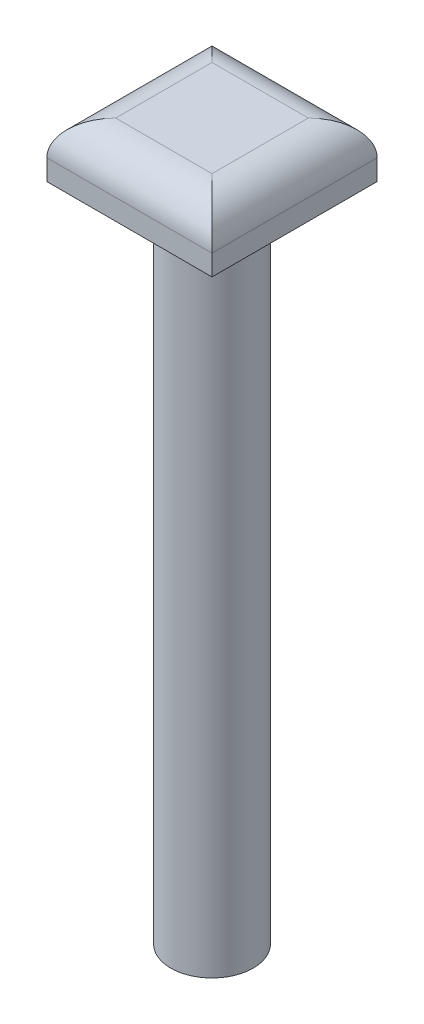
ISO-10303-21;
HEADER;
FILE_DESCRIPTION(('STEP AP214'),'2;1');
FILE_NAME('part.step','',(''),(''),'','','');
FILE_SCHEMA(('AUTOMOTIVE_DESIGN { 1 0 10303 214 1 1 1 1 }'));
ENDSEC;
DATA;
#1=APPLICATION_CONTEXT('core data for automotive mechanical design processes');
#2=APPLICATION_PROTOCOL_DEFINITION('international standard','automotive_design',2000,#1);
#3=PRODUCT_CONTEXT('',#1,'mechanical');
#4=PRODUCT('Part','Part','',(#3));
#5=PRODUCT_RELATED_PRODUCT_CATEGORY('part','',(#4));
#6=PRODUCT_DEFINITION_FORMATION('','',#4);
#7=PRODUCT_DEFINITION_CONTEXT('part definition',#1,'design');
#8=PRODUCT_DEFINITION('design','',#6,#7);
#9=PRODUCT_DEFINITION_SHAPE('','',#8);
#10=(LENGTH_UNIT() NAMED_UNIT(*) SI_UNIT(.MILLI.,.METRE.));
#11=(NAMED_UNIT(*) PLANE_ANGLE_UNIT() SI_UNIT($,.RADIAN.));
#12=(NAMED_UNIT(*) SI_UNIT($,.STERADIAN.) SOLID_ANGLE_UNIT());
#13=UNCERTAINTY_MEASURE_WITH_UNIT(LENGTH_MEASURE(1.E-05),#10,'distance_accuracy_value','');
#14=(GEOMETRIC_REPRESENTATION_CONTEXT(3) GLOBAL_UNCERTAINTY_ASSIGNED_CONTEXT((#13)) GLOBAL_UNIT_ASSIGNED_CONTEXT((#10,
#11,#12)) REPRESENTATION_CONTEXT('',''));
#15=CARTESIAN_POINT('',(0.,0.,0.));
#16=DIRECTION('',(0.,0.,1.));
#17=DIRECTION('',(1.,0.,0.));
#18=AXIS2_PLACEMENT_3D('',#15,#16,#17);
#19=CARTESIAN_POINT('',(-12.,48.,0.));
#20=DIRECTION('',(0.,1.,0.));
#21=DIRECTION('',(-1.,0.,0.));
#22=AXIS2_PLACEMENT_3D('',#19,#20,#21);
#23=PLANE('',#22);
#24=CARTESIAN_POINT('',(0.,48.,0.));
#25=DIRECTION('',(0.,-1.,0.));
#26=DIRECTION('',(1.,0.,0.));
#27=AXIS2_PLACEMENT_3D('',#24,#25,#26);
#28=CIRCLE('',#27,6.);
#29=CARTESIAN_POINT('',(6.00000000000001,48.,0.));
#30=VERTEX_POINT('',#29);
#31=EDGE_CURVE('E122',#30,#30,#28,.T.);
#32=ORIENTED_EDGE('',*,*,#31,.F.);
#33=EDGE_LOOP('',(#32));
#34=FACE_BOUND('',#33,.T.);
#35=DIRECTION('',(1.,0.,0.));
#36=VECTOR('',#35,1.);
#37=CARTESIAN_POINT('',(12.,48.,-12.));
#38=LINE('',#37,#36);
#39=CARTESIAN_POINT('',(-12.,48.,-12.));
#40=VERTEX_POINT('',#39);
#41=CARTESIAN_POINT('',(12.,48.,-12.));
#42=VERTEX_POINT('',#41);
#43=EDGE_CURVE('E100',#40,#42,#38,.T.);
#44=ORIENTED_EDGE('',*,*,#43,.T.);
#45=DIRECTION('',(0.,0.,1.));
#46=VECTOR('',#45,1.);
#47=CARTESIAN_POINT('',(12.,48.,12.));
#48=LINE('',#47,#46);
#49=CARTESIAN_POINT('',(12.,48.,12.));
#50=VERTEX_POINT('',#49);
#51=EDGE_CURVE('E105',#42,#50,#48,.T.);
#52=ORIENTED_EDGE('',*,*,#51,.T.);
#53=DIRECTION('',(-1.,0.,0.));
#54=VECTOR('',#53,1.);
#55=CARTESIAN_POINT('',(12.,48.,12.));
#56=LINE('',#55,#54);
#57=CARTESIAN_POINT('',(-12.,48.,12.));
#58=VERTEX_POINT('',#57);
#59=EDGE_CURVE('E97',#50,#58,#56,.T.);
#60=ORIENTED_EDGE('',*,*,#59,.T.);
#61=DIRECTION('',(0.,0.,-1.));
#62=VECTOR('',#61,1.);
#63=CARTESIAN_POINT('',(-12.,48.,12.));
#64=LINE('',#63,#62);
#65=EDGE_CURVE('E92',#58,#40,#64,.T.);
#66=ORIENTED_EDGE('',*,*,#65,.T.);
#67=EDGE_LOOP('',(#44,#52,#60,#66));
#68=FACE_BOUND('',#67,.T.);
#69=ADVANCED_FACE('F33',(#34,#68),#23,.F.);
#70=CARTESIAN_POINT('',(0.,-48.,0.));
#71=DIRECTION('',(0.,-1.,0.));
#72=DIRECTION('',(1.,0.,0.));
#73=AXIS2_PLACEMENT_3D('',#70,#71,#72);
#74=CYLINDRICAL_SURFACE('',#73,5.99999999999999);
#75=CARTESIAN_POINT('',(0.,-48.,0.));
#76=DIRECTION('',(0.,-1.,0.));
#77=DIRECTION('',(1.,0.,0.));
#78=AXIS2_PLACEMENT_3D('',#75,#76,#77);
#79=CIRCLE('',#78,5.99999999999999);
#80=CARTESIAN_POINT('',(6.,-48.,0.));
#81=VERTEX_POINT('',#80);
#82=EDGE_CURVE('E116',#81,#81,#79,.T.);
#83=ORIENTED_EDGE('',*,*,#82,.F.);
#84=EDGE_LOOP('',(#83));
#85=FACE_BOUND('',#84,.T.);
#86=ORIENTED_EDGE('',*,*,#31,.T.);
#87=EDGE_LOOP('',(#86));
#88=FACE_BOUND('',#87,.T.);
#89=ADVANCED_FACE('F167',(#85,#88),#74,.T.);
#90=CARTESIAN_POINT('',(-5.99999999999998,-48.,0.));
#91=DIRECTION('',(0.,1.,0.));
#92=DIRECTION('',(-1.,0.,0.));
#93=AXIS2_PLACEMENT_3D('',#90,#91,#92);
#94=PLANE('',#93);
#95=ORIENTED_EDGE('',*,*,#82,.T.);
#96=EDGE_LOOP('',(#95));
#97=FACE_BOUND('',#96,.T.);
#98=ADVANCED_FACE('F173',(#97),#94,.F.);
#99=CARTESIAN_POINT('',(-12.,56.,12.));
#100=DIRECTION('',(-1.,0.,0.));
#101=DIRECTION('',(0.,0.,1.));
#102=AXIS2_PLACEMENT_3D('',#99,#100,#101);
#103=PLANE('',#102);
#104=DIRECTION('',(0.,-1.,0.));
#105=VECTOR('',#104,1.);
#106=CARTESIAN_POINT('',(-12.,56.,12.));
#107=LINE('',#106,#105);
#108=CARTESIAN_POINT('',(-12.,51.,12.));
#109=VERTEX_POINT('',#108);
#110=EDGE_CURVE('E114',#109,#58,#107,.T.);
#111=ORIENTED_EDGE('',*,*,#110,.F.);
#112=DIRECTION('',(0.,0.,-1.));
#113=VECTOR('',#112,1.);
#114=CARTESIAN_POINT('',(-12.,51.,-12.));
#115=LINE('',#114,#113);
#116=CARTESIAN_POINT('',(-12.,51.,-12.));
#117=VERTEX_POINT('',#116);
#118=EDGE_CURVE('E95',#109,#117,#115,.T.);
#119=ORIENTED_EDGE('',*,*,#118,.T.);
#120=DIRECTION('',(0.,-1.,0.));
#121=VECTOR('',#120,1.);
#122=CARTESIAN_POINT('',(-12.,56.,-12.));
#123=LINE('',#122,#121);
#124=EDGE_CURVE('E87',#117,#40,#123,.T.);
#125=ORIENTED_EDGE('',*,*,#124,.T.);
#126=ORIENTED_EDGE('',*,*,#65,.F.);
#127=EDGE_LOOP('',(#111,#119,#125,#126));
#128=FACE_BOUND('',#127,.T.);
#129=ADVANCED_FACE('F90',(#128),#103,.T.);
#130=CARTESIAN_POINT('',(12.,56.,12.));
#131=DIRECTION('',(0.,0.,1.));
#132=DIRECTION('',(1.,0.,0.));
#133=AXIS2_PLACEMENT_3D('',#130,#131,#132);
#134=PLANE('',#133);
#135=DIRECTION('',(0.,-1.,0.));
#136=VECTOR('',#135,1.);
#137=CARTESIAN_POINT('',(12.,56.,12.));
#138=LINE('',#137,#136);
#139=CARTESIAN_POINT('',(12.,51.,12.));
#140=VERTEX_POINT('',#139);
#141=EDGE_CURVE('E117',#140,#50,#138,.T.);
#142=ORIENTED_EDGE('',*,*,#141,.F.);
#143=DIRECTION('',(-1.,0.,0.));
#144=VECTOR('',#143,1.);
#145=CARTESIAN_POINT('',(-12.,51.,12.));
#146=LINE('',#145,#144);
#147=EDGE_CURVE('E11',#140,#109,#146,.T.);
#148=ORIENTED_EDGE('',*,*,#147,.T.);
#149=ORIENTED_EDGE('',*,*,#110,.T.);
#150=ORIENTED_EDGE('',*,*,#59,.F.);
#151=EDGE_LOOP('',(#142,#148,#149,#150));
#152=FACE_BOUND('',#151,.T.);
#153=ADVANCED_FACE('F155',(#152),#134,.T.);
#154=CARTESIAN_POINT('',(12.,56.,12.));
#155=DIRECTION('',(1.,0.,0.));
#156=DIRECTION('',(0.,0.,-1.));
#157=AXIS2_PLACEMENT_3D('',#154,#155,#156);
#158=PLANE('',#157);
#159=DIRECTION('',(0.,-1.,0.));
#160=VECTOR('',#159,1.);
#161=CARTESIAN_POINT('',(12.,56.,-12.));
#162=LINE('',#161,#160);
#163=CARTESIAN_POINT('',(12.,51.,-12.));
#164=VERTEX_POINT('',#163);
#165=EDGE_CURVE('E96',#164,#42,#162,.T.);
#166=ORIENTED_EDGE('',*,*,#165,.F.);
#167=DIRECTION('',(0.,0.,1.));
#168=VECTOR('',#167,1.);
#169=CARTESIAN_POINT('',(12.,51.,12.));
#170=LINE('',#169,#168);
#171=EDGE_CURVE('E42',#164,#140,#170,.T.);
#172=ORIENTED_EDGE('',*,*,#171,.T.);
#173=ORIENTED_EDGE('',*,*,#141,.T.);
#174=ORIENTED_EDGE('',*,*,#51,.F.);
#175=EDGE_LOOP('',(#166,#172,#173,#174));
#176=FACE_BOUND('',#175,.T.);
#177=ADVANCED_FACE('F156',(#176),#158,.T.);
#178=CARTESIAN_POINT('',(12.,56.,-12.));
#179=DIRECTION('',(0.,0.,-1.));
#180=DIRECTION('',(-1.,0.,0.));
#181=AXIS2_PLACEMENT_3D('',#178,#179,#180);
#182=PLANE('',#181);
#183=ORIENTED_EDGE('',*,*,#124,.F.);
#184=DIRECTION('',(1.,0.,0.));
#185=VECTOR('',#184,1.);
#186=CARTESIAN_POINT('',(12.,51.,-12.));
#187=LINE('',#186,#185);
#188=EDGE_CURVE('E57',#117,#164,#187,.T.);
#189=ORIENTED_EDGE('',*,*,#188,.T.);
#190=ORIENTED_EDGE('',*,*,#165,.T.);
#191=ORIENTED_EDGE('',*,*,#43,.F.);
#192=EDGE_LOOP('',(#183,#189,#190,#191));
#193=FACE_BOUND('',#192,.T.);
#194=ADVANCED_FACE('F101',(#193),#182,.T.);
#195=CARTESIAN_POINT('',(0.,56.,0.));
#196=DIRECTION('',(0.,-1.,0.));
#197=DIRECTION('',(1.,0.,0.));
#198=AXIS2_PLACEMENT_3D('',#195,#196,#197);
#199=PLANE('',#198);
#200=DIRECTION('',(1.,0.,0.));
#201=VECTOR('',#200,1.);
#202=CARTESIAN_POINT('',(-12.,56.,-7.));
#203=LINE('',#202,#201);
#204=CARTESIAN_POINT('',(7.,56.,-7.));
#205=VERTEX_POINT('',#204);
#206=CARTESIAN_POINT('',(-7.,56.,-7.));
#207=VERTEX_POINT('',#206);
#208=EDGE_CURVE('E130',#205,#207,#203,.F.);
#209=ORIENTED_EDGE('',*,*,#208,.T.);
#210=DIRECTION('',(0.,0.,-1.));
#211=VECTOR('',#210,1.);
#212=CARTESIAN_POINT('',(-7.,56.,12.));
#213=LINE('',#212,#211);
#214=CARTESIAN_POINT('',(-7.,56.,7.));
#215=VERTEX_POINT('',#214);
#216=EDGE_CURVE('E132',#207,#215,#213,.F.);
#217=ORIENTED_EDGE('',*,*,#216,.T.);
#218=DIRECTION('',(-1.,0.,0.));
#219=VECTOR('',#218,1.);
#220=CARTESIAN_POINT('',(12.,56.,7.));
#221=LINE('',#220,#219);
#222=CARTESIAN_POINT('',(7.,56.,7.));
#223=VERTEX_POINT('',#222);
#224=EDGE_CURVE('E126',#215,#223,#221,.F.);
#225=ORIENTED_EDGE('',*,*,#224,.T.);
#226=DIRECTION('',(0.,0.,1.));
#227=VECTOR('',#226,1.);
#228=CARTESIAN_POINT('',(7.,56.,-12.));
#229=LINE('',#228,#227);
#230=EDGE_CURVE('E128',#223,#205,#229,.F.);
#231=ORIENTED_EDGE('',*,*,#230,.T.);
#232=EDGE_LOOP('',(#209,#217,#225,#231));
#233=FACE_BOUND('',#232,.T.);
#234=ADVANCED_FACE('F163',(#233),#199,.F.);
#235=CARTESIAN_POINT('',(7.,51.,12.));
#236=DIRECTION('',(0.,0.,-1.));
#237=DIRECTION('',(-1.,0.,0.));
#238=AXIS2_PLACEMENT_3D('',#235,#236,#237);
#239=CYLINDRICAL_SURFACE('',#238,5.);
#240=CARTESIAN_POINT('',(7.,51.,-7.));
#241=DIRECTION('',(-0.707106781186547,0.,-0.707106781186548));
#242=DIRECTION('',(0.707106781186547,0.,-0.707106781186547));
#243=AXIS2_PLACEMENT_3D('',#240,#241,#242);
#244=ELLIPSE('',#243,7.07106781186548,5.);
#245=EDGE_CURVE('E110',#205,#164,#244,.T.);
#246=ORIENTED_EDGE('',*,*,#245,.F.);
#247=ORIENTED_EDGE('',*,*,#230,.F.);
#248=CARTESIAN_POINT('',(7.,51.,7.));
#249=DIRECTION('',(0.707106781186547,0.,-0.707106781186547));
#250=DIRECTION('',(0.707106781186547,0.,0.707106781186548));
#251=AXIS2_PLACEMENT_3D('',#248,#249,#250);
#252=ELLIPSE('',#251,7.07106781186547,5.);
#253=EDGE_CURVE('E37',#140,#223,#252,.F.);
#254=ORIENTED_EDGE('',*,*,#253,.F.);
#255=ORIENTED_EDGE('',*,*,#171,.F.);
#256=EDGE_LOOP('',(#246,#247,#254,#255));
#257=FACE_BOUND('',#256,.T.);
#258=ADVANCED_FACE('F35',(#257),#239,.T.);
#259=CARTESIAN_POINT('',(12.,51.,7.));
#260=DIRECTION('',(1.,0.,0.));
#261=DIRECTION('',(0.,1.,0.));
#262=AXIS2_PLACEMENT_3D('',#259,#260,#261);
#263=CYLINDRICAL_SURFACE('',#262,5.);
#264=ORIENTED_EDGE('',*,*,#253,.T.);
#265=ORIENTED_EDGE('',*,*,#224,.F.);
#266=CARTESIAN_POINT('',(-7.,51.,7.));
#267=DIRECTION('',(0.707106781186547,0.,0.707106781186548));
#268=DIRECTION('',(0.707106781186548,0.,-0.707106781186547));
#269=AXIS2_PLACEMENT_3D('',#266,#267,#268);
#270=ELLIPSE('',#269,7.07106781186548,5.);
#271=EDGE_CURVE('E139',#109,#215,#270,.F.);
#272=ORIENTED_EDGE('',*,*,#271,.F.);
#273=ORIENTED_EDGE('',*,*,#147,.F.);
#274=EDGE_LOOP('',(#264,#265,#272,#273));
#275=FACE_BOUND('',#274,.T.);
#276=ADVANCED_FACE('F153',(#275),#263,.T.);
#277=CARTESIAN_POINT('',(12.,51.,-7.));
#278=DIRECTION('',(-1.,0.,0.));
#279=DIRECTION('',(0.,-1.,0.));
#280=AXIS2_PLACEMENT_3D('',#277,#278,#279);
#281=CYLINDRICAL_SURFACE('',#280,5.);
#282=ORIENTED_EDGE('',*,*,#245,.T.);
#283=ORIENTED_EDGE('',*,*,#188,.F.);
#284=CARTESIAN_POINT('',(-7.,51.,-7.));
#285=DIRECTION('',(-0.707106781186548,0.,0.707106781186547));
#286=DIRECTION('',(-0.707106781186547,0.,-0.707106781186548));
#287=AXIS2_PLACEMENT_3D('',#284,#285,#286);
#288=ELLIPSE('',#287,7.07106781186547,5.);
#289=EDGE_CURVE('E137',#207,#117,#288,.T.);
#290=ORIENTED_EDGE('',*,*,#289,.F.);
#291=ORIENTED_EDGE('',*,*,#208,.F.);
#292=EDGE_LOOP('',(#282,#283,#290,#291));
#293=FACE_BOUND('',#292,.T.);
#294=ADVANCED_FACE('F144',(#293),#281,.T.);
#295=CARTESIAN_POINT('',(-7.,51.,12.));
#296=DIRECTION('',(0.,0.,1.));
#297=DIRECTION('',(1.,0.,0.));
#298=AXIS2_PLACEMENT_3D('',#295,#296,#297);
#299=CYLINDRICAL_SURFACE('',#298,5.);
#300=ORIENTED_EDGE('',*,*,#271,.T.);
#301=ORIENTED_EDGE('',*,*,#216,.F.);
#302=ORIENTED_EDGE('',*,*,#289,.T.);
#303=ORIENTED_EDGE('',*,*,#118,.F.);
#304=EDGE_LOOP('',(#300,#301,#302,#303));
#305=FACE_BOUND('',#304,.T.);
#306=ADVANCED_FACE('F182',(#305),#299,.T.);
#307=CLOSED_SHELL('',(#69,#89,#98,#129,#153,#177,#194,#234,#258,#276,#294,#306));
#308=MANIFOLD_SOLID_BREP('B2',#307);
#309=ADVANCED_BREP_SHAPE_REPRESENTATION('',(#18,#308),#14);
#310=SHAPE_DEFINITION_REPRESENTATION(#9,#309);
ENDSEC;
END-ISO-10303-21;
